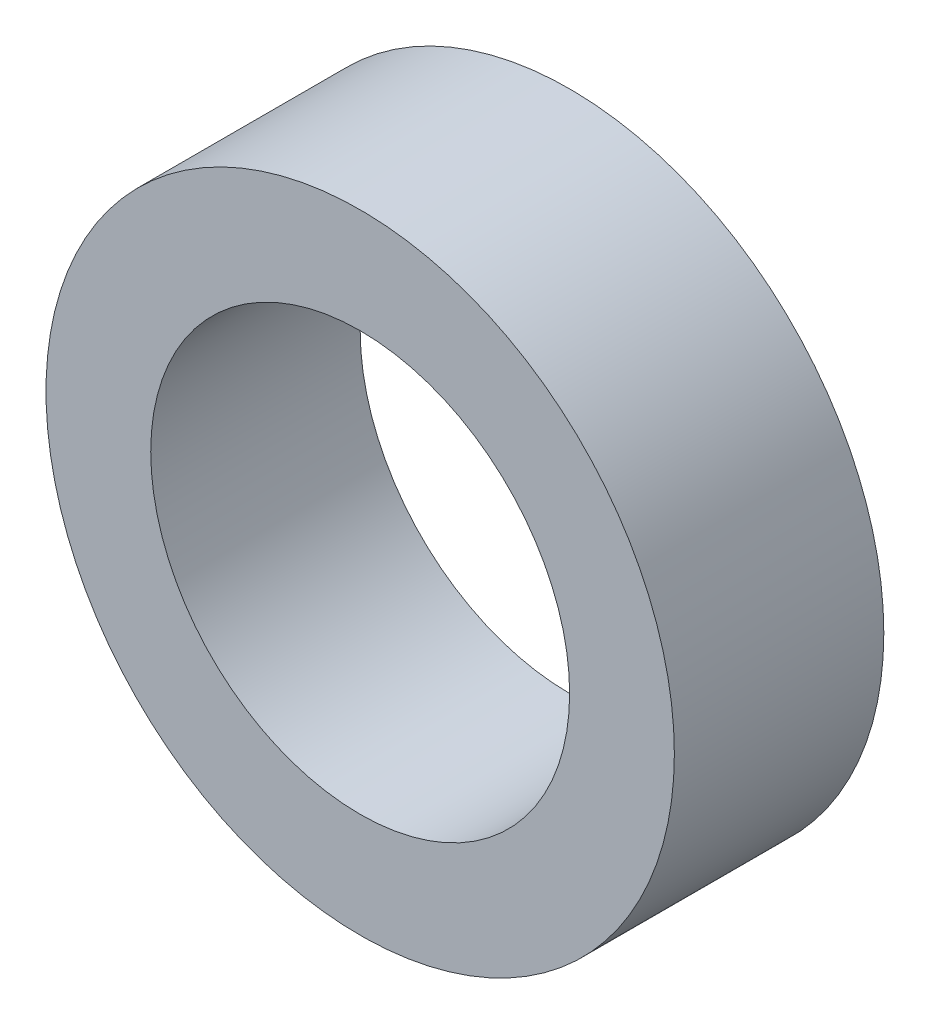
ISO-10303-21;
HEADER;
FILE_DESCRIPTION(('STEP AP214'),'2;1');
FILE_NAME('part.step','',(''),(''),'','','');
FILE_SCHEMA(('AUTOMOTIVE_DESIGN { 1 0 10303 214 1 1 1 1 }'));
ENDSEC;
DATA;
#1=APPLICATION_CONTEXT('core data for automotive mechanical design processes');
#2=APPLICATION_PROTOCOL_DEFINITION('international standard','automotive_design',2000,#1);
#3=PRODUCT_CONTEXT('',#1,'mechanical');
#4=PRODUCT('Part','Part','',(#3));
#5=PRODUCT_RELATED_PRODUCT_CATEGORY('part','',(#4));
#6=PRODUCT_DEFINITION_FORMATION('','',#4);
#7=PRODUCT_DEFINITION_CONTEXT('part definition',#1,'design');
#8=PRODUCT_DEFINITION('design','',#6,#7);
#9=PRODUCT_DEFINITION_SHAPE('','',#8);
#10=(LENGTH_UNIT() NAMED_UNIT(*) SI_UNIT(.MILLI.,.METRE.));
#11=(NAMED_UNIT(*) PLANE_ANGLE_UNIT() SI_UNIT($,.RADIAN.));
#12=(NAMED_UNIT(*) SI_UNIT($,.STERADIAN.) SOLID_ANGLE_UNIT());
#13=UNCERTAINTY_MEASURE_WITH_UNIT(LENGTH_MEASURE(1.E-05),#10,'distance_accuracy_value','');
#14=(GEOMETRIC_REPRESENTATION_CONTEXT(3) GLOBAL_UNCERTAINTY_ASSIGNED_CONTEXT((#13)) GLOBAL_UNIT_ASSIGNED_CONTEXT((#10,
#11,#12)) REPRESENTATION_CONTEXT('',''));
#15=CARTESIAN_POINT('',(0.,0.,0.));
#16=DIRECTION('',(0.,0.,1.));
#17=DIRECTION('',(1.,0.,0.));
#18=AXIS2_PLACEMENT_3D('',#15,#16,#17);
#19=CARTESIAN_POINT('',(0.,0.,3.175));
#20=DIRECTION('',(0.,0.,1.));
#21=DIRECTION('',(1.,0.,0.));
#22=AXIS2_PLACEMENT_3D('',#19,#20,#21);
#23=PLANE('',#22);
#24=CARTESIAN_POINT('',(0.,0.,3.175));
#25=DIRECTION('',(0.,0.,1.));
#26=DIRECTION('',(1.,0.,0.));
#27=AXIS2_PLACEMENT_3D('',#24,#25,#26);
#28=CIRCLE('',#27,4.7625);
#29=CARTESIAN_POINT('',(4.7625,0.,3.175));
#30=VERTEX_POINT('',#29);
#31=EDGE_CURVE('E10',#30,#30,#28,.T.);
#32=ORIENTED_EDGE('',*,*,#31,.T.);
#33=EDGE_LOOP('',(#32));
#34=FACE_BOUND('',#33,.T.);
#35=CARTESIAN_POINT('',(0.,0.,3.175));
#36=DIRECTION('',(0.,0.,1.));
#37=DIRECTION('',(1.,0.,0.));
#38=AXIS2_PLACEMENT_3D('',#35,#36,#37);
#39=CIRCLE('',#38,3.175);
#40=CARTESIAN_POINT('',(3.175,0.,3.175));
#41=VERTEX_POINT('',#40);
#42=EDGE_CURVE('E42',#41,#41,#39,.T.);
#43=ORIENTED_EDGE('',*,*,#42,.F.);
#44=EDGE_LOOP('',(#43));
#45=FACE_BOUND('',#44,.T.);
#46=ADVANCED_FACE('F31',(#34,#45),#23,.T.);
#47=CARTESIAN_POINT('',(0.,0.,0.));
#48=DIRECTION('',(0.,0.,1.));
#49=DIRECTION('',(1.,0.,0.));
#50=AXIS2_PLACEMENT_3D('',#47,#48,#49);
#51=PLANE('',#50);
#52=CARTESIAN_POINT('',(0.,0.,0.));
#53=DIRECTION('',(0.,0.,1.));
#54=DIRECTION('',(1.,0.,0.));
#55=AXIS2_PLACEMENT_3D('',#52,#53,#54);
#56=CIRCLE('',#55,4.7625);
#57=CARTESIAN_POINT('',(4.7625,0.,0.));
#58=VERTEX_POINT('',#57);
#59=EDGE_CURVE('E35',#58,#58,#56,.T.);
#60=ORIENTED_EDGE('',*,*,#59,.F.);
#61=EDGE_LOOP('',(#60));
#62=FACE_BOUND('',#61,.T.);
#63=CARTESIAN_POINT('',(0.,0.,0.));
#64=DIRECTION('',(0.,0.,1.));
#65=DIRECTION('',(1.,0.,0.));
#66=AXIS2_PLACEMENT_3D('',#63,#64,#65);
#67=CIRCLE('',#66,3.175);
#68=CARTESIAN_POINT('',(3.175,0.,0.));
#69=VERTEX_POINT('',#68);
#70=EDGE_CURVE('E44',#69,#69,#67,.T.);
#71=ORIENTED_EDGE('',*,*,#70,.T.);
#72=EDGE_LOOP('',(#71));
#73=FACE_BOUND('',#72,.T.);
#74=ADVANCED_FACE('F54',(#62,#73),#51,.F.);
#75=CARTESIAN_POINT('',(0.,0.,3.175));
#76=DIRECTION('',(0.,0.,-1.));
#77=DIRECTION('',(-1.,0.,0.));
#78=AXIS2_PLACEMENT_3D('',#75,#76,#77);
#79=CYLINDRICAL_SURFACE('',#78,4.7625);
#80=ORIENTED_EDGE('',*,*,#31,.F.);
#81=EDGE_LOOP('',(#80));
#82=FACE_BOUND('',#81,.T.);
#83=ORIENTED_EDGE('',*,*,#59,.T.);
#84=EDGE_LOOP('',(#83));
#85=FACE_BOUND('',#84,.T.);
#86=ADVANCED_FACE('F33',(#82,#85),#79,.T.);
#87=CARTESIAN_POINT('',(0.,0.,3.175));
#88=DIRECTION('',(0.,0.,-1.));
#89=DIRECTION('',(-1.,0.,0.));
#90=AXIS2_PLACEMENT_3D('',#87,#88,#89);
#91=CYLINDRICAL_SURFACE('',#90,3.175);
#92=ORIENTED_EDGE('',*,*,#42,.T.);
#93=EDGE_LOOP('',(#92));
#94=FACE_BOUND('',#93,.T.);
#95=ORIENTED_EDGE('',*,*,#70,.F.);
#96=EDGE_LOOP('',(#95));
#97=FACE_BOUND('',#96,.T.);
#98=ADVANCED_FACE('F50',(#94,#97),#91,.F.);
#99=CLOSED_SHELL('',(#46,#74,#86,#98));
#100=MANIFOLD_SOLID_BREP('B2',#99);
#101=ADVANCED_BREP_SHAPE_REPRESENTATION('',(#18,#100),#14);
#102=SHAPE_DEFINITION_REPRESENTATION(#9,#101);
ENDSEC;
END-ISO-10303-21;
